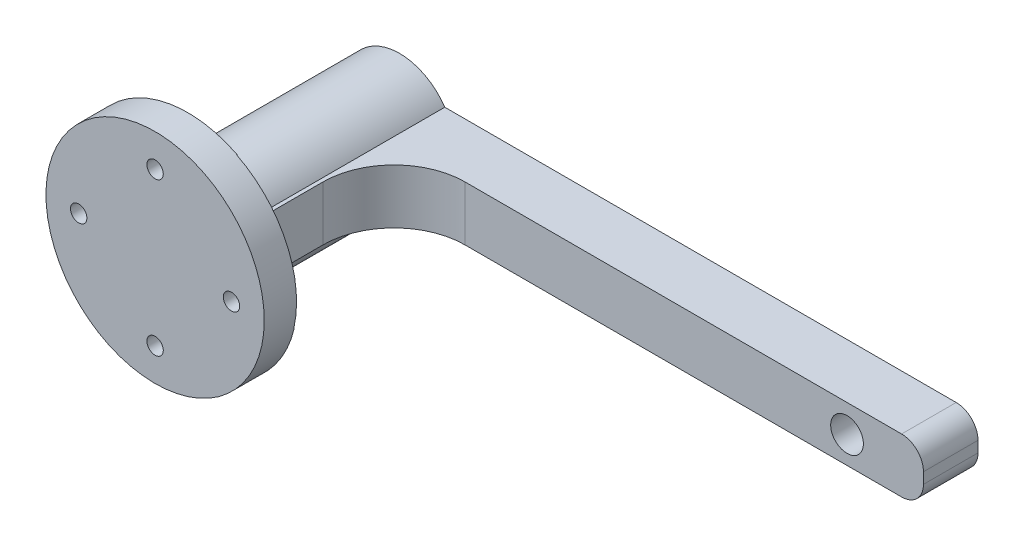
ISO-10303-21;
HEADER;
FILE_DESCRIPTION(('STEP AP214'),'2;1');
FILE_NAME('part.step','',(''),(''),'','','');
FILE_SCHEMA(('AUTOMOTIVE_DESIGN { 1 0 10303 214 1 1 1 1 }'));
ENDSEC;
DATA;
#1=APPLICATION_CONTEXT('core data for automotive mechanical design processes');
#2=APPLICATION_PROTOCOL_DEFINITION('international standard','automotive_design',2000,#1);
#3=PRODUCT_CONTEXT('',#1,'mechanical');
#4=PRODUCT('Part','Part','',(#3));
#5=PRODUCT_RELATED_PRODUCT_CATEGORY('part','',(#4));
#6=PRODUCT_DEFINITION_FORMATION('','',#4);
#7=PRODUCT_DEFINITION_CONTEXT('part definition',#1,'design');
#8=PRODUCT_DEFINITION('design','',#6,#7);
#9=PRODUCT_DEFINITION_SHAPE('','',#8);
#10=(LENGTH_UNIT() NAMED_UNIT(*) SI_UNIT(.MILLI.,.METRE.));
#11=(NAMED_UNIT(*) PLANE_ANGLE_UNIT() SI_UNIT($,.RADIAN.));
#12=(NAMED_UNIT(*) SI_UNIT($,.STERADIAN.) SOLID_ANGLE_UNIT());
#13=UNCERTAINTY_MEASURE_WITH_UNIT(LENGTH_MEASURE(1.E-05),#10,'distance_accuracy_value','');
#14=(GEOMETRIC_REPRESENTATION_CONTEXT(3) GLOBAL_UNCERTAINTY_ASSIGNED_CONTEXT((#13)) GLOBAL_UNIT_ASSIGNED_CONTEXT((#10,
#11,#12)) REPRESENTATION_CONTEXT('',''));
#15=CARTESIAN_POINT('',(0.,0.,0.));
#16=DIRECTION('',(0.,0.,1.));
#17=DIRECTION('',(1.,0.,0.));
#18=AXIS2_PLACEMENT_3D('',#15,#16,#17);
#19=CARTESIAN_POINT('',(0.,0.,0.));
#20=DIRECTION('',(0.,0.,1.));
#21=DIRECTION('',(1.,0.,0.));
#22=AXIS2_PLACEMENT_3D('',#19,#20,#21);
#23=PLANE('',#22);
#24=CARTESIAN_POINT('',(0.,-7.,0.));
#25=DIRECTION('',(0.,0.,-1.));
#26=DIRECTION('',(-1.,0.,0.));
#27=AXIS2_PLACEMENT_3D('',#24,#25,#26);
#28=CIRCLE('',#27,0.75);
#29=CARTESIAN_POINT('',(-0.749999999999951,-7.,0.));
#30=VERTEX_POINT('',#29);
#31=EDGE_CURVE('E213',#30,#30,#28,.T.);
#32=ORIENTED_EDGE('',*,*,#31,.F.);
#33=EDGE_LOOP('',(#32));
#34=FACE_BOUND('',#33,.T.);
#35=CARTESIAN_POINT('',(-7.,0.,0.));
#36=DIRECTION('',(0.,0.,-1.));
#37=DIRECTION('',(-1.,0.,0.));
#38=AXIS2_PLACEMENT_3D('',#35,#36,#37);
#39=CIRCLE('',#38,0.75);
#40=CARTESIAN_POINT('',(-7.75,0.,0.));
#41=VERTEX_POINT('',#40);
#42=EDGE_CURVE('E207',#41,#41,#39,.T.);
#43=ORIENTED_EDGE('',*,*,#42,.F.);
#44=EDGE_LOOP('',(#43));
#45=FACE_BOUND('',#44,.T.);
#46=CARTESIAN_POINT('',(0.,7.,0.));
#47=DIRECTION('',(0.,0.,-1.));
#48=DIRECTION('',(-1.,0.,0.));
#49=AXIS2_PLACEMENT_3D('',#46,#47,#48);
#50=CIRCLE('',#49,0.75);
#51=CARTESIAN_POINT('',(-0.75,7.,0.));
#52=VERTEX_POINT('',#51);
#53=EDGE_CURVE('E204',#52,#52,#50,.T.);
#54=ORIENTED_EDGE('',*,*,#53,.F.);
#55=EDGE_LOOP('',(#54));
#56=FACE_BOUND('',#55,.T.);
#57=CARTESIAN_POINT('',(0.,0.,0.));
#58=DIRECTION('',(0.,0.,1.));
#59=DIRECTION('',(1.,0.,0.));
#60=AXIS2_PLACEMENT_3D('',#57,#58,#59);
#61=CIRCLE('',#60,10.);
#62=CARTESIAN_POINT('',(4.4893939113422,8.93562209970876,0.));
#63=VERTEX_POINT('',#62);
#64=CARTESIAN_POINT('',(9.75472489059514,-2.20121382623396,0.));
#65=VERTEX_POINT('',#64);
#66=EDGE_CURVE('E203',#63,#65,#61,.T.);
#67=ORIENTED_EDGE('',*,*,#66,.F.);
#68=DIRECTION('',(0.,-1.,0.));
#69=VECTOR('',#68,1.);
#70=CARTESIAN_POINT('',(4.4893939113422,0.,0.));
#71=LINE('',#70,#69);
#72=CARTESIAN_POINT('',(4.4893939113422,2.79878617376604,0.));
#73=VERTEX_POINT('',#72);
#74=EDGE_CURVE('E169',#63,#73,#71,.T.);
#75=ORIENTED_EDGE('',*,*,#74,.T.);
#76=DIRECTION('',(-1.,0.,0.));
#77=VECTOR('',#76,1.);
#78=CARTESIAN_POINT('',(53.,2.79878617376604,0.));
#79=LINE('',#78,#77);
#80=CARTESIAN_POINT('',(4.14328323356442,2.79878617376604,0.));
#81=VERTEX_POINT('',#80);
#82=EDGE_CURVE('E182',#73,#81,#79,.T.);
#83=ORIENTED_EDGE('',*,*,#82,.T.);
#84=CARTESIAN_POINT('',(0.,0.,0.));
#85=DIRECTION('',(0.,0.,1.));
#86=DIRECTION('',(1.,0.,0.));
#87=AXIS2_PLACEMENT_3D('',#84,#85,#86);
#88=CIRCLE('',#87,5.);
#89=CARTESIAN_POINT('',(4.4893939113422,-2.20121382623396,0.));
#90=VERTEX_POINT('',#89);
#91=EDGE_CURVE('E224',#90,#81,#88,.F.);
#92=ORIENTED_EDGE('',*,*,#91,.F.);
#93=DIRECTION('',(-1.,0.,0.));
#94=VECTOR('',#93,1.);
#95=CARTESIAN_POINT('',(53.,-2.20121382623396,0.));
#96=LINE('',#95,#94);
#97=EDGE_CURVE('E188',#65,#90,#96,.T.);
#98=ORIENTED_EDGE('',*,*,#97,.F.);
#99=EDGE_LOOP('',(#67,#75,#83,#92,#98));
#100=FACE_BOUND('',#99,.T.);
#101=ADVANCED_FACE('F41',(#34,#45,#56,#100),#23,.F.);
#102=CARTESIAN_POINT('',(0.,0.,-19.4));
#103=DIRECTION('',(0.,0.,1.));
#104=DIRECTION('',(1.,0.,0.));
#105=AXIS2_PLACEMENT_3D('',#102,#103,#104);
#106=CYLINDRICAL_SURFACE('',#105,5.);
#107=DIRECTION('',(0.,0.,1.));
#108=VECTOR('',#107,1.);
#109=CARTESIAN_POINT('',(4.4893939113422,-2.20121382623396,-19.4));
#110=LINE('',#109,#108);
#111=CARTESIAN_POINT('',(4.4893939113422,-2.20121382623396,-7.9));
#112=VERTEX_POINT('',#111);
#113=EDGE_CURVE('E194',#90,#112,#110,.F.);
#114=ORIENTED_EDGE('',*,*,#113,.F.);
#115=ORIENTED_EDGE('',*,*,#91,.T.);
#116=DIRECTION('',(0.,0.,1.));
#117=VECTOR('',#116,1.);
#118=CARTESIAN_POINT('',(4.14328323356442,2.79878617376604,-19.4));
#119=LINE('',#118,#117);
#120=CARTESIAN_POINT('',(4.14328323356442,2.79878617376604,-19.4));
#121=VERTEX_POINT('',#120);
#122=EDGE_CURVE('E190',#121,#81,#119,.T.);
#123=ORIENTED_EDGE('',*,*,#122,.F.);
#124=CARTESIAN_POINT('',(0.,0.,-19.4));
#125=DIRECTION('',(0.,0.,-1.));
#126=DIRECTION('',(-1.,0.,0.));
#127=AXIS2_PLACEMENT_3D('',#124,#125,#126);
#128=CIRCLE('',#127,5.);
#129=CARTESIAN_POINT('',(4.4893939113422,-2.20121382623396,-19.4));
#130=VERTEX_POINT('',#129);
#131=EDGE_CURVE('E196',#130,#121,#128,.T.);
#132=ORIENTED_EDGE('',*,*,#131,.F.);
#133=EDGE_CURVE('E193',#112,#130,#110,.F.);
#134=ORIENTED_EDGE('',*,*,#133,.F.);
#135=EDGE_LOOP('',(#114,#115,#123,#132,#134));
#136=FACE_BOUND('',#135,.T.);
#137=ADVANCED_FACE('F263',(#136),#106,.T.);
#138=CARTESIAN_POINT('',(0.,0.,3.));
#139=DIRECTION('',(0.,0.,-1.));
#140=DIRECTION('',(-1.,0.,0.));
#141=AXIS2_PLACEMENT_3D('',#138,#139,#140);
#142=CYLINDRICAL_SURFACE('',#141,10.);
#143=CARTESIAN_POINT('',(0.,0.,3.));
#144=DIRECTION('',(0.,0.,1.));
#145=DIRECTION('',(1.,0.,0.));
#146=AXIS2_PLACEMENT_3D('',#143,#144,#145);
#147=CIRCLE('',#146,10.);
#148=CARTESIAN_POINT('',(10.,0.,3.));
#149=VERTEX_POINT('',#148);
#150=EDGE_CURVE('E221',#149,#149,#147,.T.);
#151=ORIENTED_EDGE('',*,*,#150,.F.);
#152=EDGE_LOOP('',(#151));
#153=FACE_BOUND('',#152,.T.);
#154=CARTESIAN_POINT('',(0.,0.,0.0387734372759847));
#155=DIRECTION('',(0.,0.,1.));
#156=DIRECTION('',(1.,0.,0.));
#157=AXIS2_PLACEMENT_3D('',#154,#155,#156);
#158=CIRCLE('',#157,10.);
#159=CARTESIAN_POINT('',(9.75472489059514,-2.20121382623396,0.0387734372759857));
#160=VERTEX_POINT('',#159);
#161=CARTESIAN_POINT('',(4.4893939113422,8.93562209970876,0.0387734372759853));
#162=VERTEX_POINT('',#161);
#163=EDGE_CURVE('E176',#160,#162,#158,.T.);
#164=ORIENTED_EDGE('',*,*,#163,.T.);
#165=DIRECTION('',(0.,0.,-1.));
#166=VECTOR('',#165,1.);
#167=CARTESIAN_POINT('',(4.4893939113422,8.93562209970876,3.));
#168=LINE('',#167,#166);
#169=EDGE_CURVE('E172',#162,#63,#168,.T.);
#170=ORIENTED_EDGE('',*,*,#169,.T.);
#171=ORIENTED_EDGE('',*,*,#66,.T.);
#172=DIRECTION('',(0.,0.,-1.));
#173=VECTOR('',#172,1.);
#174=CARTESIAN_POINT('',(9.75472489059514,-2.20121382623396,3.));
#175=LINE('',#174,#173);
#176=EDGE_CURVE('E157',#65,#160,#175,.F.);
#177=ORIENTED_EDGE('',*,*,#176,.T.);
#178=EDGE_LOOP('',(#164,#170,#171,#177));
#179=FACE_BOUND('',#178,.T.);
#180=ADVANCED_FACE('F282',(#153,#179),#142,.T.);
#181=CARTESIAN_POINT('',(0.,0.,3.));
#182=DIRECTION('',(0.,0.,1.));
#183=DIRECTION('',(1.,0.,0.));
#184=AXIS2_PLACEMENT_3D('',#181,#182,#183);
#185=PLANE('',#184);
#186=CARTESIAN_POINT('',(0.,7.,3.));
#187=DIRECTION('',(0.,0.,-1.));
#188=DIRECTION('',(-1.,0.,0.));
#189=AXIS2_PLACEMENT_3D('',#186,#187,#188);
#190=CIRCLE('',#189,0.75);
#191=CARTESIAN_POINT('',(-0.75,7.,3.));
#192=VERTEX_POINT('',#191);
#193=EDGE_CURVE('E200',#192,#192,#190,.T.);
#194=ORIENTED_EDGE('',*,*,#193,.T.);
#195=EDGE_LOOP('',(#194));
#196=FACE_BOUND('',#195,.T.);
#197=CARTESIAN_POINT('',(-7.,0.,3.));
#198=DIRECTION('',(0.,0.,-1.));
#199=DIRECTION('',(-1.,0.,0.));
#200=AXIS2_PLACEMENT_3D('',#197,#198,#199);
#201=CIRCLE('',#200,0.75);
#202=CARTESIAN_POINT('',(-7.75,0.,3.));
#203=VERTEX_POINT('',#202);
#204=EDGE_CURVE('E210',#203,#203,#201,.T.);
#205=ORIENTED_EDGE('',*,*,#204,.T.);
#206=EDGE_LOOP('',(#205));
#207=FACE_BOUND('',#206,.T.);
#208=CARTESIAN_POINT('',(0.,-7.,3.));
#209=DIRECTION('',(0.,0.,-1.));
#210=DIRECTION('',(-1.,0.,0.));
#211=AXIS2_PLACEMENT_3D('',#208,#209,#210);
#212=CIRCLE('',#211,0.75);
#213=CARTESIAN_POINT('',(-0.749999999999951,-7.,3.));
#214=VERTEX_POINT('',#213);
#215=EDGE_CURVE('E216',#214,#214,#212,.T.);
#216=ORIENTED_EDGE('',*,*,#215,.T.);
#217=EDGE_LOOP('',(#216));
#218=FACE_BOUND('',#217,.T.);
#219=CARTESIAN_POINT('',(7.,0.,3.));
#220=DIRECTION('',(0.,0.,-1.));
#221=DIRECTION('',(-1.,0.,0.));
#222=AXIS2_PLACEMENT_3D('',#219,#220,#221);
#223=CIRCLE('',#222,0.75);
#224=CARTESIAN_POINT('',(6.25,0.,3.));
#225=VERTEX_POINT('',#224);
#226=EDGE_CURVE('E199',#225,#225,#223,.T.);
#227=ORIENTED_EDGE('',*,*,#226,.T.);
#228=EDGE_LOOP('',(#227));
#229=FACE_BOUND('',#228,.T.);
#230=ORIENTED_EDGE('',*,*,#150,.T.);
#231=EDGE_LOOP('',(#230));
#232=FACE_BOUND('',#231,.T.);
#233=ADVANCED_FACE('F288',(#196,#207,#218,#229,#232),#185,.T.);
#234=CARTESIAN_POINT('',(7.,0.,3.));
#235=DIRECTION('',(0.,0.,-1.));
#236=DIRECTION('',(-1.,0.,0.));
#237=AXIS2_PLACEMENT_3D('',#234,#235,#236);
#238=CYLINDRICAL_SURFACE('',#237,0.75);
#239=CARTESIAN_POINT('',(7.,0.,0.0387734372759856));
#240=DIRECTION('',(0.,0.,1.));
#241=DIRECTION('',(1.,0.,0.));
#242=AXIS2_PLACEMENT_3D('',#239,#240,#241);
#243=CIRCLE('',#242,0.75);
#244=CARTESIAN_POINT('',(7.75,0.,0.0387734372759857));
#245=VERTEX_POINT('',#244);
#246=EDGE_CURVE('E175',#245,#245,#243,.F.);
#247=ORIENTED_EDGE('',*,*,#246,.T.);
#248=EDGE_LOOP('',(#247));
#249=FACE_BOUND('',#248,.T.);
#250=ORIENTED_EDGE('',*,*,#226,.F.);
#251=EDGE_LOOP('',(#250));
#252=FACE_BOUND('',#251,.T.);
#253=ADVANCED_FACE('F296',(#249,#252),#238,.F.);
#254=CARTESIAN_POINT('',(0.,-7.,3.));
#255=DIRECTION('',(0.,0.,-1.));
#256=DIRECTION('',(-1.,0.,0.));
#257=AXIS2_PLACEMENT_3D('',#254,#255,#256);
#258=CYLINDRICAL_SURFACE('',#257,0.75);
#259=ORIENTED_EDGE('',*,*,#215,.F.);
#260=EDGE_LOOP('',(#259));
#261=FACE_BOUND('',#260,.T.);
#262=ORIENTED_EDGE('',*,*,#31,.T.);
#263=EDGE_LOOP('',(#262));
#264=FACE_BOUND('',#263,.T.);
#265=ADVANCED_FACE('F328',(#261,#264),#258,.F.);
#266=CARTESIAN_POINT('',(-7.,0.,3.));
#267=DIRECTION('',(0.,0.,-1.));
#268=DIRECTION('',(-1.,0.,0.));
#269=AXIS2_PLACEMENT_3D('',#266,#267,#268);
#270=CYLINDRICAL_SURFACE('',#269,0.75);
#271=ORIENTED_EDGE('',*,*,#204,.F.);
#272=EDGE_LOOP('',(#271));
#273=FACE_BOUND('',#272,.T.);
#274=ORIENTED_EDGE('',*,*,#42,.T.);
#275=EDGE_LOOP('',(#274));
#276=FACE_BOUND('',#275,.T.);
#277=ADVANCED_FACE('F320',(#273,#276),#270,.F.);
#278=CARTESIAN_POINT('',(0.,7.,3.));
#279=DIRECTION('',(0.,0.,-1.));
#280=DIRECTION('',(-1.,0.,0.));
#281=AXIS2_PLACEMENT_3D('',#278,#279,#280);
#282=CYLINDRICAL_SURFACE('',#281,0.75);
#283=ORIENTED_EDGE('',*,*,#193,.F.);
#284=EDGE_LOOP('',(#283));
#285=FACE_BOUND('',#284,.T.);
#286=ORIENTED_EDGE('',*,*,#53,.T.);
#287=EDGE_LOOP('',(#286));
#288=FACE_BOUND('',#287,.T.);
#289=ADVANCED_FACE('F313',(#285,#288),#282,.F.);
#290=CARTESIAN_POINT('',(0.,0.,-19.4));
#291=DIRECTION('',(0.,0.,-1.));
#292=DIRECTION('',(-1.,0.,0.));
#293=AXIS2_PLACEMENT_3D('',#290,#291,#292);
#294=PLANE('',#293);
#295=CARTESIAN_POINT('',(46.,0.261084442842763,-19.4));
#296=DIRECTION('',(0.,0.,-1.));
#297=DIRECTION('',(-1.,0.,0.));
#298=AXIS2_PLACEMENT_3D('',#295,#296,#297);
#299=CIRCLE('',#298,1.50000000000008);
#300=CARTESIAN_POINT('',(44.4999999999999,0.261084442842763,-19.4));
#301=VERTEX_POINT('',#300);
#302=EDGE_CURVE('E235',#301,#301,#299,.T.);
#303=ORIENTED_EDGE('',*,*,#302,.F.);
#304=EDGE_LOOP('',(#303));
#305=FACE_BOUND('',#304,.T.);
#306=DIRECTION('',(-1.,0.,0.));
#307=VECTOR('',#306,1.);
#308=CARTESIAN_POINT('',(53.,2.79878617376604,-19.4));
#309=LINE('',#308,#307);
#310=CARTESIAN_POINT('',(51.,2.79878617376604,-19.4));
#311=VERTEX_POINT('',#310);
#312=EDGE_CURVE('E184',#311,#121,#309,.T.);
#313=ORIENTED_EDGE('',*,*,#312,.F.);
#314=CARTESIAN_POINT('',(51.,0.798786173766039,-19.4));
#315=DIRECTION('',(0.,0.,-1.));
#316=DIRECTION('',(-1.,0.,0.));
#317=AXIS2_PLACEMENT_3D('',#314,#315,#316);
#318=CIRCLE('',#317,2.);
#319=CARTESIAN_POINT('',(53.,0.798786173766039,-19.4));
#320=VERTEX_POINT('',#319);
#321=EDGE_CURVE('E49',#311,#320,#318,.T.);
#322=ORIENTED_EDGE('',*,*,#321,.T.);
#323=DIRECTION('',(0.,1.,0.));
#324=VECTOR('',#323,1.);
#325=CARTESIAN_POINT('',(53.,2.79878617376604,-19.4));
#326=LINE('',#325,#324);
#327=CARTESIAN_POINT('',(53.,-0.201213826233961,-19.4));
#328=VERTEX_POINT('',#327);
#329=EDGE_CURVE('E179',#328,#320,#326,.T.);
#330=ORIENTED_EDGE('',*,*,#329,.F.);
#331=CARTESIAN_POINT('',(51.,-0.201213826233961,-19.4));
#332=DIRECTION('',(0.,0.,-1.));
#333=DIRECTION('',(-1.,0.,0.));
#334=AXIS2_PLACEMENT_3D('',#331,#332,#333);
#335=CIRCLE('',#334,2.);
#336=CARTESIAN_POINT('',(51.,-2.20121382623396,-19.4));
#337=VERTEX_POINT('',#336);
#338=EDGE_CURVE('E56',#328,#337,#335,.T.);
#339=ORIENTED_EDGE('',*,*,#338,.T.);
#340=DIRECTION('',(-1.,0.,0.));
#341=VECTOR('',#340,1.);
#342=CARTESIAN_POINT('',(53.,-2.20121382623396,-19.4));
#343=LINE('',#342,#341);
#344=EDGE_CURVE('E186',#337,#130,#343,.T.);
#345=ORIENTED_EDGE('',*,*,#344,.T.);
#346=ORIENTED_EDGE('',*,*,#131,.T.);
#347=EDGE_LOOP('',(#313,#322,#330,#339,#345,#346));
#348=FACE_BOUND('',#347,.T.);
#349=ADVANCED_FACE('F247',(#305,#348),#294,.T.);
#350=CARTESIAN_POINT('',(53.,0.,0.));
#351=DIRECTION('',(1.,0.,0.));
#352=DIRECTION('',(0.,0.,-1.));
#353=AXIS2_PLACEMENT_3D('',#350,#351,#352);
#354=PLANE('',#353);
#355=ORIENTED_EDGE('',*,*,#329,.T.);
#356=DIRECTION('',(0.,0.,1.));
#357=VECTOR('',#356,1.);
#358=CARTESIAN_POINT('',(53.,0.798786173766039,-14.4));
#359=LINE('',#358,#357);
#360=CARTESIAN_POINT('',(53.,0.798786173766039,-14.4));
#361=VERTEX_POINT('',#360);
#362=EDGE_CURVE('E238',#320,#361,#359,.T.);
#363=ORIENTED_EDGE('',*,*,#362,.T.);
#364=DIRECTION('',(0.,-1.,0.));
#365=VECTOR('',#364,1.);
#366=CARTESIAN_POINT('',(53.,10.,-14.4));
#367=LINE('',#366,#365);
#368=CARTESIAN_POINT('',(53.,-0.201213826233962,-14.4));
#369=VERTEX_POINT('',#368);
#370=EDGE_CURVE('E134',#361,#369,#367,.T.);
#371=ORIENTED_EDGE('',*,*,#370,.T.);
#372=DIRECTION('',(0.,0.,-1.));
#373=VECTOR('',#372,1.);
#374=CARTESIAN_POINT('',(53.,-0.201213826233961,-19.4));
#375=LINE('',#374,#373);
#376=EDGE_CURVE('E229',#369,#328,#375,.T.);
#377=ORIENTED_EDGE('',*,*,#376,.T.);
#378=EDGE_LOOP('',(#355,#363,#371,#377));
#379=FACE_BOUND('',#378,.T.);
#380=ADVANCED_FACE('F251',(#379),#354,.T.);
#381=CARTESIAN_POINT('',(53.,2.79878617376604,0.));
#382=DIRECTION('',(0.,-1.,0.));
#383=DIRECTION('',(0.,0.,-1.));
#384=AXIS2_PLACEMENT_3D('',#381,#382,#383);
#385=PLANE('',#384);
#386=DIRECTION('',(1.,0.,0.));
#387=VECTOR('',#386,1.);
#388=CARTESIAN_POINT('',(53.,2.79878617376604,-14.4));
#389=LINE('',#388,#387);
#390=CARTESIAN_POINT('',(10.9893939113422,2.79878617376604,-14.4));
#391=VERTEX_POINT('',#390);
#392=CARTESIAN_POINT('',(51.,2.79878617376604,-14.4));
#393=VERTEX_POINT('',#392);
#394=EDGE_CURVE('E131',#391,#393,#389,.T.);
#395=ORIENTED_EDGE('',*,*,#394,.T.);
#396=DIRECTION('',(0.,0.,1.));
#397=VECTOR('',#396,1.);
#398=CARTESIAN_POINT('',(51.,2.79878617376604,-19.4));
#399=LINE('',#398,#397);
#400=EDGE_CURVE('E64',#393,#311,#399,.F.);
#401=ORIENTED_EDGE('',*,*,#400,.T.);
#402=ORIENTED_EDGE('',*,*,#312,.T.);
#403=ORIENTED_EDGE('',*,*,#122,.T.);
#404=ORIENTED_EDGE('',*,*,#82,.F.);
#405=DIRECTION('',(0.,0.,-1.));
#406=VECTOR('',#405,1.);
#407=CARTESIAN_POINT('',(4.4893939113422,2.79878617376604,0.));
#408=LINE('',#407,#406);
#409=CARTESIAN_POINT('',(4.4893939113422,2.79878617376604,-7.9));
#410=VERTEX_POINT('',#409);
#411=EDGE_CURVE('E166',#73,#410,#408,.T.);
#412=ORIENTED_EDGE('',*,*,#411,.T.);
#413=CARTESIAN_POINT('',(10.9893939113422,2.79878617376604,-7.9));
#414=DIRECTION('',(0.,-1.,0.));
#415=DIRECTION('',(0.,0.,-1.));
#416=AXIS2_PLACEMENT_3D('',#413,#414,#415);
#417=CIRCLE('',#416,6.5);
#418=EDGE_CURVE('E163',#410,#391,#417,.T.);
#419=ORIENTED_EDGE('',*,*,#418,.T.);
#420=EDGE_LOOP('',(#395,#401,#402,#403,#404,#412,#419));
#421=FACE_BOUND('',#420,.T.);
#422=ADVANCED_FACE('F254',(#421),#385,.F.);
#423=CARTESIAN_POINT('',(53.,-2.20121382623396,0.));
#424=DIRECTION('',(0.,1.,0.));
#425=DIRECTION('',(0.,0.,1.));
#426=AXIS2_PLACEMENT_3D('',#423,#424,#425);
#427=PLANE('',#426);
#428=ORIENTED_EDGE('',*,*,#344,.F.);
#429=DIRECTION('',(0.,0.,-1.));
#430=VECTOR('',#429,1.);
#431=CARTESIAN_POINT('',(51.,-2.20121382623396,-14.4));
#432=LINE('',#431,#430);
#433=CARTESIAN_POINT('',(51.,-2.20121382623396,-14.4));
#434=VERTEX_POINT('',#433);
#435=EDGE_CURVE('E11',#337,#434,#432,.F.);
#436=ORIENTED_EDGE('',*,*,#435,.T.);
#437=DIRECTION('',(1.,0.,0.));
#438=VECTOR('',#437,1.);
#439=CARTESIAN_POINT('',(10.9893939113422,-2.20121382623396,-14.4));
#440=LINE('',#439,#438);
#441=CARTESIAN_POINT('',(10.9893939113422,-2.20121382623396,-14.4));
#442=VERTEX_POINT('',#441);
#443=EDGE_CURVE('E129',#442,#434,#440,.T.);
#444=ORIENTED_EDGE('',*,*,#443,.F.);
#445=CARTESIAN_POINT('',(10.9893939113422,-2.20121382623396,-7.9));
#446=DIRECTION('',(0.,-1.,0.));
#447=DIRECTION('',(0.,0.,-1.));
#448=AXIS2_PLACEMENT_3D('',#445,#446,#447);
#449=CIRCLE('',#448,6.5);
#450=EDGE_CURVE('E139',#112,#442,#449,.T.);
#451=ORIENTED_EDGE('',*,*,#450,.F.);
#452=ORIENTED_EDGE('',*,*,#133,.T.);
#453=EDGE_LOOP('',(#428,#436,#444,#451,#452));
#454=FACE_BOUND('',#453,.T.);
#455=ADVANCED_FACE('F147',(#454),#427,.F.);
#456=CARTESIAN_POINT('',(4.4893939113422,10.,0.038773437275985));
#457=DIRECTION('',(0.,0.,1.));
#458=DIRECTION('',(1.,0.,0.));
#459=AXIS2_PLACEMENT_3D('',#456,#457,#458);
#460=PLANE('',#459);
#461=ORIENTED_EDGE('',*,*,#246,.F.);
#462=EDGE_LOOP('',(#461));
#463=FACE_BOUND('',#462,.T.);
#464=DIRECTION('',(-1.,0.,0.));
#465=VECTOR('',#464,1.);
#466=CARTESIAN_POINT('',(4.4893939113422,-2.20121382623396,0.038773437275985));
#467=LINE('',#466,#465);
#468=CARTESIAN_POINT('',(4.4893939113422,-2.20121382623396,0.038773437275985));
#469=VERTEX_POINT('',#468);
#470=EDGE_CURVE('E149',#160,#469,#467,.T.);
#471=ORIENTED_EDGE('',*,*,#470,.T.);
#472=DIRECTION('',(0.,-1.,0.));
#473=VECTOR('',#472,1.);
#474=CARTESIAN_POINT('',(4.4893939113422,10.,0.038773437275985));
#475=LINE('',#474,#473);
#476=EDGE_CURVE('E155',#162,#469,#475,.T.);
#477=ORIENTED_EDGE('',*,*,#476,.F.);
#478=ORIENTED_EDGE('',*,*,#163,.F.);
#479=EDGE_LOOP('',(#471,#477,#478));
#480=FACE_BOUND('',#479,.T.);
#481=ADVANCED_FACE('F303',(#463,#480),#460,.F.);
#482=CARTESIAN_POINT('',(4.4893939113422,10.,0.038773437275985));
#483=DIRECTION('',(-1.,0.,0.));
#484=DIRECTION('',(0.,0.,1.));
#485=AXIS2_PLACEMENT_3D('',#482,#483,#484);
#486=PLANE('',#485);
#487=ORIENTED_EDGE('',*,*,#476,.T.);
#488=DIRECTION('',(0.,0.,-1.));
#489=VECTOR('',#488,1.);
#490=CARTESIAN_POINT('',(4.4893939113422,-2.20121382623396,0.038773437275985));
#491=LINE('',#490,#489);
#492=EDGE_CURVE('E145',#469,#90,#491,.T.);
#493=ORIENTED_EDGE('',*,*,#492,.T.);
#494=ORIENTED_EDGE('',*,*,#113,.T.);
#495=DIRECTION('',(0.,-1.,0.));
#496=VECTOR('',#495,1.);
#497=CARTESIAN_POINT('',(4.4893939113422,10.,-7.9));
#498=LINE('',#497,#496);
#499=EDGE_CURVE('E135',#410,#112,#498,.T.);
#500=ORIENTED_EDGE('',*,*,#499,.F.);
#501=ORIENTED_EDGE('',*,*,#411,.F.);
#502=ORIENTED_EDGE('',*,*,#74,.F.);
#503=ORIENTED_EDGE('',*,*,#169,.F.);
#504=EDGE_LOOP('',(#487,#493,#494,#500,#501,#502,#503));
#505=FACE_BOUND('',#504,.T.);
#506=ADVANCED_FACE('F257',(#505),#486,.F.);
#507=CARTESIAN_POINT('',(10.9893939113422,10.,-14.4));
#508=DIRECTION('',(0.,0.,-1.));
#509=DIRECTION('',(-1.,0.,0.));
#510=AXIS2_PLACEMENT_3D('',#507,#508,#509);
#511=PLANE('',#510);
#512=CARTESIAN_POINT('',(46.,0.261084442842763,-14.4));
#513=DIRECTION('',(0.,0.,-1.));
#514=DIRECTION('',(-1.,0.,0.));
#515=AXIS2_PLACEMENT_3D('',#512,#513,#514);
#516=CIRCLE('',#515,1.50000000000008);
#517=CARTESIAN_POINT('',(44.4999999999999,0.261084442842763,-14.4));
#518=VERTEX_POINT('',#517);
#519=EDGE_CURVE('E232',#518,#518,#516,.T.);
#520=ORIENTED_EDGE('',*,*,#519,.T.);
#521=EDGE_LOOP('',(#520));
#522=FACE_BOUND('',#521,.T.);
#523=ORIENTED_EDGE('',*,*,#370,.F.);
#524=CARTESIAN_POINT('',(51.,0.798786173766039,-14.4));
#525=DIRECTION('',(0.,0.,-1.));
#526=DIRECTION('',(-1.,0.,0.));
#527=AXIS2_PLACEMENT_3D('',#524,#525,#526);
#528=CIRCLE('',#527,2.);
#529=EDGE_CURVE('E243',#361,#393,#528,.F.);
#530=ORIENTED_EDGE('',*,*,#529,.T.);
#531=ORIENTED_EDGE('',*,*,#394,.F.);
#532=DIRECTION('',(0.,-1.,0.));
#533=VECTOR('',#532,1.);
#534=CARTESIAN_POINT('',(10.9893939113422,10.,-14.4));
#535=LINE('',#534,#533);
#536=EDGE_CURVE('E124',#391,#442,#535,.T.);
#537=ORIENTED_EDGE('',*,*,#536,.T.);
#538=ORIENTED_EDGE('',*,*,#443,.T.);
#539=CARTESIAN_POINT('',(51.,-0.201213826233961,-14.4));
#540=DIRECTION('',(0.,0.,-1.));
#541=DIRECTION('',(-1.,0.,0.));
#542=AXIS2_PLACEMENT_3D('',#539,#540,#541);
#543=CIRCLE('',#542,2.);
#544=EDGE_CURVE('E241',#434,#369,#543,.F.);
#545=ORIENTED_EDGE('',*,*,#544,.T.);
#546=EDGE_LOOP('',(#523,#530,#531,#537,#538,#545));
#547=FACE_BOUND('',#546,.T.);
#548=ADVANCED_FACE('F127',(#522,#547),#511,.F.);
#549=CARTESIAN_POINT('',(10.9893939113422,10.,-7.9));
#550=DIRECTION('',(0.,-1.,0.));
#551=DIRECTION('',(0.,0.,-1.));
#552=AXIS2_PLACEMENT_3D('',#549,#550,#551);
#553=CYLINDRICAL_SURFACE('',#552,6.5);
#554=ORIENTED_EDGE('',*,*,#499,.T.);
#555=ORIENTED_EDGE('',*,*,#450,.T.);
#556=ORIENTED_EDGE('',*,*,#536,.F.);
#557=ORIENTED_EDGE('',*,*,#418,.F.);
#558=EDGE_LOOP('',(#554,#555,#556,#557));
#559=FACE_BOUND('',#558,.T.);
#560=ADVANCED_FACE('F140',(#559),#553,.F.);
#561=CARTESIAN_POINT('',(10.9893939113422,-2.20121382623396,-7.9));
#562=DIRECTION('',(0.,-1.,0.));
#563=DIRECTION('',(0.,0.,-1.));
#564=AXIS2_PLACEMENT_3D('',#561,#562,#563);
#565=PLANE('',#564);
#566=ORIENTED_EDGE('',*,*,#492,.F.);
#567=ORIENTED_EDGE('',*,*,#470,.F.);
#568=ORIENTED_EDGE('',*,*,#176,.F.);
#569=ORIENTED_EDGE('',*,*,#97,.T.);
#570=EDGE_LOOP('',(#566,#567,#568,#569));
#571=FACE_BOUND('',#570,.T.);
#572=ADVANCED_FACE('F305',(#571),#565,.F.);
#573=CARTESIAN_POINT('',(46.,0.261084442842763,3.));
#574=DIRECTION('',(0.,0.,-1.));
#575=DIRECTION('',(-1.,0.,0.));
#576=AXIS2_PLACEMENT_3D('',#573,#574,#575);
#577=CYLINDRICAL_SURFACE('',#576,1.50000000000008);
#578=ORIENTED_EDGE('',*,*,#302,.T.);
#579=EDGE_LOOP('',(#578));
#580=FACE_BOUND('',#579,.T.);
#581=ORIENTED_EDGE('',*,*,#519,.F.);
#582=EDGE_LOOP('',(#581));
#583=FACE_BOUND('',#582,.T.);
#584=ADVANCED_FACE('F274',(#580,#583),#577,.F.);
#585=CARTESIAN_POINT('',(51.,0.798786173766039,0.));
#586=DIRECTION('',(0.,0.,-1.));
#587=DIRECTION('',(-1.,0.,0.));
#588=AXIS2_PLACEMENT_3D('',#585,#586,#587);
#589=CYLINDRICAL_SURFACE('',#588,2.);
#590=ORIENTED_EDGE('',*,*,#321,.F.);
#591=ORIENTED_EDGE('',*,*,#400,.F.);
#592=ORIENTED_EDGE('',*,*,#529,.F.);
#593=ORIENTED_EDGE('',*,*,#362,.F.);
#594=EDGE_LOOP('',(#590,#591,#592,#593));
#595=FACE_BOUND('',#594,.T.);
#596=ADVANCED_FACE('F253',(#595),#589,.T.);
#597=CARTESIAN_POINT('',(51.,-0.201213826233962,0.));
#598=DIRECTION('',(0.,0.,1.));
#599=DIRECTION('',(0.,-1.,0.));
#600=AXIS2_PLACEMENT_3D('',#597,#598,#599);
#601=CYLINDRICAL_SURFACE('',#600,2.);
#602=ORIENTED_EDGE('',*,*,#544,.F.);
#603=ORIENTED_EDGE('',*,*,#435,.F.);
#604=ORIENTED_EDGE('',*,*,#338,.F.);
#605=ORIENTED_EDGE('',*,*,#376,.F.);
#606=EDGE_LOOP('',(#602,#603,#604,#605));
#607=FACE_BOUND('',#606,.T.);
#608=ADVANCED_FACE('F43',(#607),#601,.T.);
#609=CLOSED_SHELL('',(#101,#137,#180,#233,#253,#265,#277,#289,#349,#380,#422,#455,#481,#506,
#548,#560,#572,#584,#596,#608));
#610=MANIFOLD_SOLID_BREP('B2',#609);
#611=ADVANCED_BREP_SHAPE_REPRESENTATION('',(#18,#610),#14);
#612=SHAPE_DEFINITION_REPRESENTATION(#9,#611);
ENDSEC;
END-ISO-10303-21;
